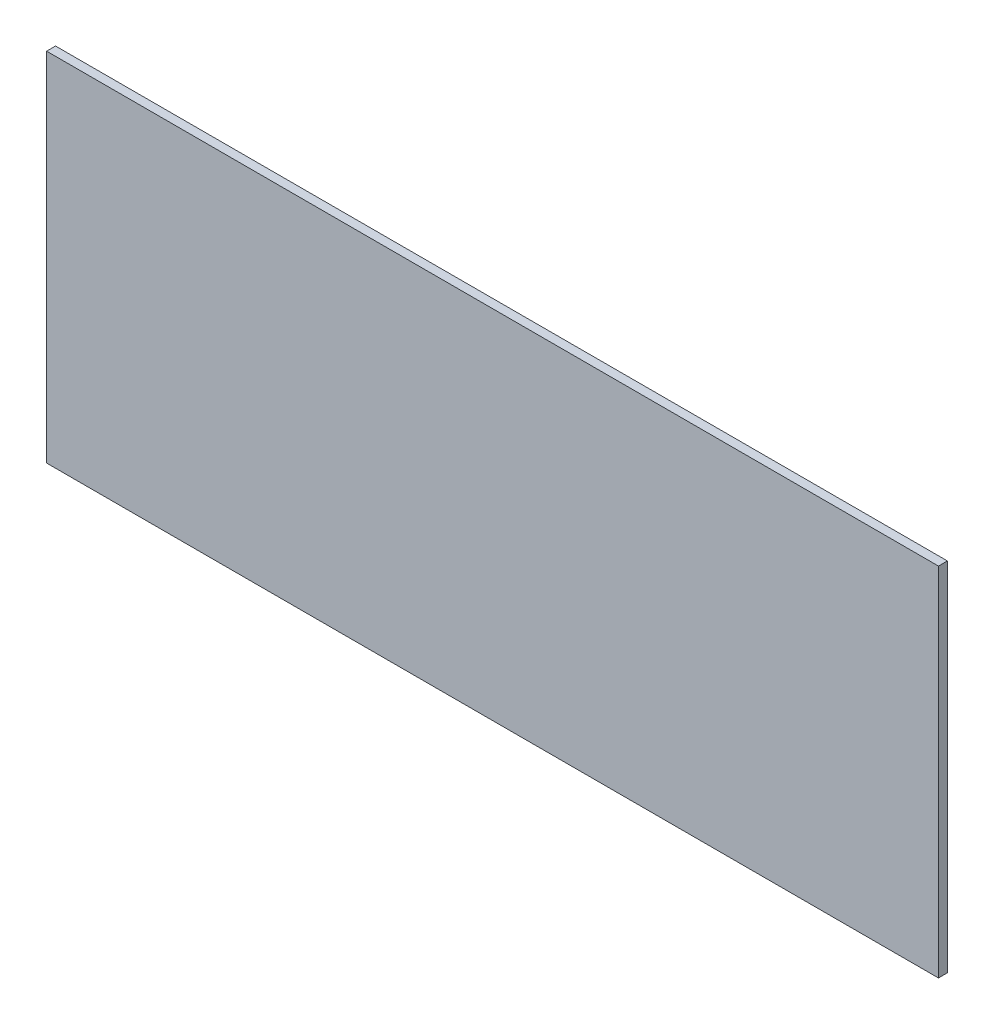
ISO-10303-21;
HEADER;
FILE_DESCRIPTION(('STEP AP214'),'2;1');
FILE_NAME('part.step','',(''),(''),'','','');
FILE_SCHEMA(('AUTOMOTIVE_DESIGN { 1 0 10303 214 1 1 1 1 }'));
ENDSEC;
DATA;
#1=APPLICATION_CONTEXT('core data for automotive mechanical design processes');
#2=APPLICATION_PROTOCOL_DEFINITION('international standard','automotive_design',2000,#1);
#3=PRODUCT_CONTEXT('',#1,'mechanical');
#4=PRODUCT('Part','Part','',(#3));
#5=PRODUCT_RELATED_PRODUCT_CATEGORY('part','',(#4));
#6=PRODUCT_DEFINITION_FORMATION('','',#4);
#7=PRODUCT_DEFINITION_CONTEXT('part definition',#1,'design');
#8=PRODUCT_DEFINITION('design','',#6,#7);
#9=PRODUCT_DEFINITION_SHAPE('','',#8);
#10=(LENGTH_UNIT() NAMED_UNIT(*) SI_UNIT(.MILLI.,.METRE.));
#11=(NAMED_UNIT(*) PLANE_ANGLE_UNIT() SI_UNIT($,.RADIAN.));
#12=(NAMED_UNIT(*) SI_UNIT($,.STERADIAN.) SOLID_ANGLE_UNIT());
#13=UNCERTAINTY_MEASURE_WITH_UNIT(LENGTH_MEASURE(1.E-05),#10,'distance_accuracy_value','');
#14=(GEOMETRIC_REPRESENTATION_CONTEXT(3) GLOBAL_UNCERTAINTY_ASSIGNED_CONTEXT((#13)) GLOBAL_UNIT_ASSIGNED_CONTEXT((#10,
#11,#12)) REPRESENTATION_CONTEXT('',''));
#15=CARTESIAN_POINT('',(0.,0.,0.));
#16=DIRECTION('',(0.,0.,1.));
#17=DIRECTION('',(1.,0.,0.));
#18=AXIS2_PLACEMENT_3D('',#15,#16,#17);
#19=CARTESIAN_POINT('',(0.,0.,2.54));
#20=DIRECTION('',(1.,0.,0.));
#21=DIRECTION('',(0.,0.,-1.));
#22=AXIS2_PLACEMENT_3D('',#19,#20,#21);
#23=PLANE('',#22);
#24=DIRECTION('',(0.,-1.,0.));
#25=VECTOR('',#24,1.);
#26=CARTESIAN_POINT('',(0.,0.,0.));
#27=LINE('',#26,#25);
#28=CARTESIAN_POINT('',(0.,101.6,0.));
#29=VERTEX_POINT('',#28);
#30=CARTESIAN_POINT('',(0.,0.,0.));
#31=VERTEX_POINT('',#30);
#32=EDGE_CURVE('E107',#29,#31,#27,.T.);
#33=ORIENTED_EDGE('',*,*,#32,.T.);
#34=DIRECTION('',(0.,0.,-1.));
#35=VECTOR('',#34,1.);
#36=CARTESIAN_POINT('',(0.,0.,2.54));
#37=LINE('',#36,#35);
#38=CARTESIAN_POINT('',(0.,0.,2.54));
#39=VERTEX_POINT('',#38);
#40=EDGE_CURVE('E11',#39,#31,#37,.T.);
#41=ORIENTED_EDGE('',*,*,#40,.F.);
#42=DIRECTION('',(0.,-1.,0.));
#43=VECTOR('',#42,1.);
#44=CARTESIAN_POINT('',(0.,0.,2.54));
#45=LINE('',#44,#43);
#46=CARTESIAN_POINT('',(0.,101.6,2.54));
#47=VERTEX_POINT('',#46);
#48=EDGE_CURVE('E91',#47,#39,#45,.T.);
#49=ORIENTED_EDGE('',*,*,#48,.F.);
#50=DIRECTION('',(0.,0.,-1.));
#51=VECTOR('',#50,1.);
#52=CARTESIAN_POINT('',(0.,101.6,2.54));
#53=LINE('',#52,#51);
#54=EDGE_CURVE('E103',#47,#29,#53,.T.);
#55=ORIENTED_EDGE('',*,*,#54,.T.);
#56=EDGE_LOOP('',(#33,#41,#49,#55));
#57=FACE_BOUND('',#56,.T.);
#58=ADVANCED_FACE('F39',(#57),#23,.F.);
#59=CARTESIAN_POINT('',(0.,0.,2.54));
#60=DIRECTION('',(0.,1.,0.));
#61=DIRECTION('',(0.,0.,1.));
#62=AXIS2_PLACEMENT_3D('',#59,#60,#61);
#63=PLANE('',#62);
#64=DIRECTION('',(1.,0.,0.));
#65=VECTOR('',#64,1.);
#66=CARTESIAN_POINT('',(0.,0.,0.));
#67=LINE('',#66,#65);
#68=CARTESIAN_POINT('',(254.,0.,0.));
#69=VERTEX_POINT('',#68);
#70=EDGE_CURVE('E96',#31,#69,#67,.T.);
#71=ORIENTED_EDGE('',*,*,#70,.T.);
#72=DIRECTION('',(0.,0.,-1.));
#73=VECTOR('',#72,1.);
#74=CARTESIAN_POINT('',(254.,0.,2.54));
#75=LINE('',#74,#73);
#76=CARTESIAN_POINT('',(254.,0.,2.54));
#77=VERTEX_POINT('',#76);
#78=EDGE_CURVE('E48',#77,#69,#75,.T.);
#79=ORIENTED_EDGE('',*,*,#78,.F.);
#80=DIRECTION('',(1.,0.,0.));
#81=VECTOR('',#80,1.);
#82=CARTESIAN_POINT('',(0.,0.,2.54));
#83=LINE('',#82,#81);
#84=EDGE_CURVE('E86',#39,#77,#83,.T.);
#85=ORIENTED_EDGE('',*,*,#84,.F.);
#86=ORIENTED_EDGE('',*,*,#40,.T.);
#87=EDGE_LOOP('',(#71,#79,#85,#86));
#88=FACE_BOUND('',#87,.T.);
#89=ADVANCED_FACE('F95',(#88),#63,.F.);
#90=CARTESIAN_POINT('',(254.,0.,2.54));
#91=DIRECTION('',(-1.,0.,0.));
#92=DIRECTION('',(0.,0.,1.));
#93=AXIS2_PLACEMENT_3D('',#90,#91,#92);
#94=PLANE('',#93);
#95=DIRECTION('',(0.,1.,0.));
#96=VECTOR('',#95,1.);
#97=CARTESIAN_POINT('',(254.,0.,0.));
#98=LINE('',#97,#96);
#99=CARTESIAN_POINT('',(254.,101.6,0.));
#100=VERTEX_POINT('',#99);
#101=EDGE_CURVE('E73',#69,#100,#98,.T.);
#102=ORIENTED_EDGE('',*,*,#101,.T.);
#103=DIRECTION('',(0.,0.,-1.));
#104=VECTOR('',#103,1.);
#105=CARTESIAN_POINT('',(254.,101.6,2.54));
#106=LINE('',#105,#104);
#107=CARTESIAN_POINT('',(254.,101.6,2.54));
#108=VERTEX_POINT('',#107);
#109=EDGE_CURVE('E98',#108,#100,#106,.T.);
#110=ORIENTED_EDGE('',*,*,#109,.F.);
#111=DIRECTION('',(0.,1.,0.));
#112=VECTOR('',#111,1.);
#113=CARTESIAN_POINT('',(254.,0.,2.54));
#114=LINE('',#113,#112);
#115=EDGE_CURVE('E89',#77,#108,#114,.T.);
#116=ORIENTED_EDGE('',*,*,#115,.F.);
#117=ORIENTED_EDGE('',*,*,#78,.T.);
#118=EDGE_LOOP('',(#102,#110,#116,#117));
#119=FACE_BOUND('',#118,.T.);
#120=ADVANCED_FACE('F99',(#119),#94,.F.);
#121=CARTESIAN_POINT('',(0.,101.6,2.54));
#122=DIRECTION('',(0.,-1.,0.));
#123=DIRECTION('',(0.,0.,-1.));
#124=AXIS2_PLACEMENT_3D('',#121,#122,#123);
#125=PLANE('',#124);
#126=DIRECTION('',(-1.,0.,0.));
#127=VECTOR('',#126,1.);
#128=CARTESIAN_POINT('',(0.,101.6,0.));
#129=LINE('',#128,#127);
#130=EDGE_CURVE('E79',#100,#29,#129,.T.);
#131=ORIENTED_EDGE('',*,*,#130,.T.);
#132=ORIENTED_EDGE('',*,*,#54,.F.);
#133=DIRECTION('',(-1.,0.,0.));
#134=VECTOR('',#133,1.);
#135=CARTESIAN_POINT('',(0.,101.6,2.54));
#136=LINE('',#135,#134);
#137=EDGE_CURVE('E56',#108,#47,#136,.T.);
#138=ORIENTED_EDGE('',*,*,#137,.F.);
#139=ORIENTED_EDGE('',*,*,#109,.T.);
#140=EDGE_LOOP('',(#131,#132,#138,#139));
#141=FACE_BOUND('',#140,.T.);
#142=ADVANCED_FACE('F120',(#141),#125,.F.);
#143=CARTESIAN_POINT('',(0.,0.,2.54));
#144=DIRECTION('',(0.,0.,-1.));
#145=DIRECTION('',(-1.,0.,0.));
#146=AXIS2_PLACEMENT_3D('',#143,#144,#145);
#147=PLANE('',#146);
#148=ORIENTED_EDGE('',*,*,#48,.T.);
#149=ORIENTED_EDGE('',*,*,#84,.T.);
#150=ORIENTED_EDGE('',*,*,#115,.T.);
#151=ORIENTED_EDGE('',*,*,#137,.T.);
#152=EDGE_LOOP('',(#148,#149,#150,#151));
#153=FACE_BOUND('',#152,.T.);
#154=ADVANCED_FACE('F87',(#153),#147,.F.);
#155=CARTESIAN_POINT('',(0.,0.,0.));
#156=DIRECTION('',(0.,0.,-1.));
#157=DIRECTION('',(-1.,0.,0.));
#158=AXIS2_PLACEMENT_3D('',#155,#156,#157);
#159=PLANE('',#158);
#160=ORIENTED_EDGE('',*,*,#32,.F.);
#161=ORIENTED_EDGE('',*,*,#130,.F.);
#162=ORIENTED_EDGE('',*,*,#101,.F.);
#163=ORIENTED_EDGE('',*,*,#70,.F.);
#164=EDGE_LOOP('',(#160,#161,#162,#163));
#165=FACE_BOUND('',#164,.T.);
#166=ADVANCED_FACE('F123',(#165),#159,.T.);
#167=CLOSED_SHELL('',(#58,#89,#120,#142,#154,#166));
#168=MANIFOLD_SOLID_BREP('B2',#167);
#169=ADVANCED_BREP_SHAPE_REPRESENTATION('',(#18,#168),#14);
#170=SHAPE_DEFINITION_REPRESENTATION(#9,#169);
ENDSEC;
END-ISO-10303-21;
